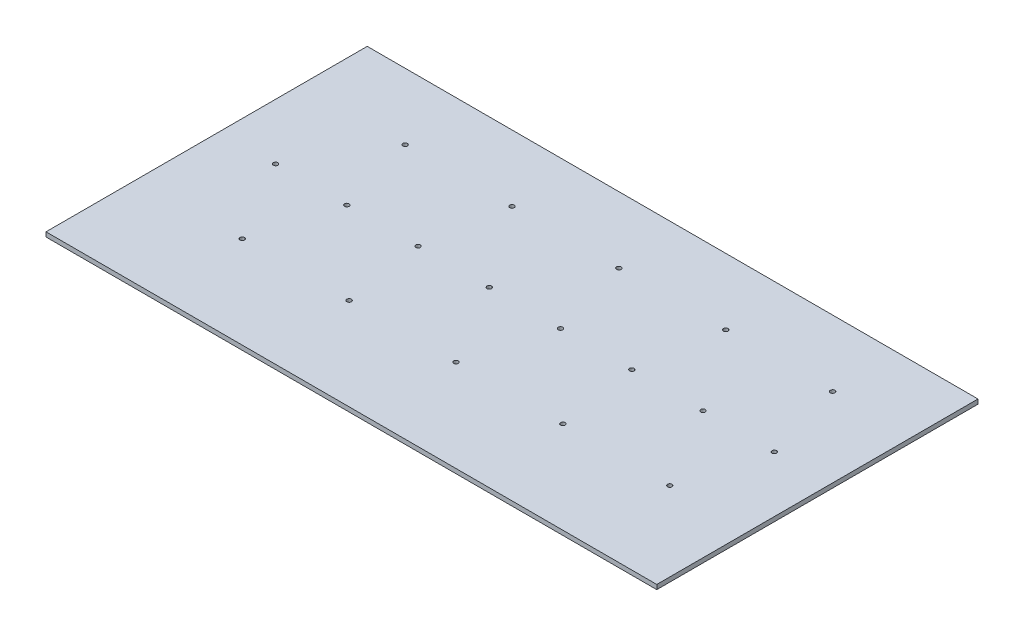
ISO-10303-21;
HEADER;
FILE_DESCRIPTION(('STEP AP214'),'2;1');
FILE_NAME('part.step','',(''),(''),'','','');
FILE_SCHEMA(('AUTOMOTIVE_DESIGN { 1 0 10303 214 1 1 1 1 }'));
ENDSEC;
DATA;
#1=APPLICATION_CONTEXT('core data for automotive mechanical design processes');
#2=APPLICATION_PROTOCOL_DEFINITION('international standard','automotive_design',2000,#1);
#3=PRODUCT_CONTEXT('',#1,'mechanical');
#4=PRODUCT('Part','Part','',(#3));
#5=PRODUCT_RELATED_PRODUCT_CATEGORY('part','',(#4));
#6=PRODUCT_DEFINITION_FORMATION('','',#4);
#7=PRODUCT_DEFINITION_CONTEXT('part definition',#1,'design');
#8=PRODUCT_DEFINITION('design','',#6,#7);
#9=PRODUCT_DEFINITION_SHAPE('','',#8);
#10=(LENGTH_UNIT() NAMED_UNIT(*) SI_UNIT(.MILLI.,.METRE.));
#11=(NAMED_UNIT(*) PLANE_ANGLE_UNIT() SI_UNIT($,.RADIAN.));
#12=(NAMED_UNIT(*) SI_UNIT($,.STERADIAN.) SOLID_ANGLE_UNIT());
#13=UNCERTAINTY_MEASURE_WITH_UNIT(LENGTH_MEASURE(1.E-05),#10,'distance_accuracy_value','');
#14=(GEOMETRIC_REPRESENTATION_CONTEXT(3) GLOBAL_UNCERTAINTY_ASSIGNED_CONTEXT((#13)) GLOBAL_UNIT_ASSIGNED_CONTEXT((#10,
#11,#12)) REPRESENTATION_CONTEXT('',''));
#15=CARTESIAN_POINT('',(0.,0.,0.));
#16=DIRECTION('',(0.,0.,1.));
#17=DIRECTION('',(1.,0.,0.));
#18=AXIS2_PLACEMENT_3D('',#15,#16,#17);
#19=CARTESIAN_POINT('',(0.,6.35,0.));
#20=DIRECTION('',(1.,0.,0.));
#21=DIRECTION('',(0.,0.,-1.));
#22=AXIS2_PLACEMENT_3D('',#19,#20,#21);
#23=PLANE('',#22);
#24=DIRECTION('',(0.,0.,1.));
#25=VECTOR('',#24,1.);
#26=CARTESIAN_POINT('',(0.,0.,0.));
#27=LINE('',#26,#25);
#28=CARTESIAN_POINT('',(0.,0.,-450.85));
#29=VERTEX_POINT('',#28);
#30=CARTESIAN_POINT('',(0.,0.,0.));
#31=VERTEX_POINT('',#30);
#32=EDGE_CURVE('E119',#29,#31,#27,.T.);
#33=ORIENTED_EDGE('',*,*,#32,.T.);
#34=DIRECTION('',(0.,-1.,0.));
#35=VECTOR('',#34,1.);
#36=CARTESIAN_POINT('',(0.,6.35,0.));
#37=LINE('',#36,#35);
#38=CARTESIAN_POINT('',(0.,6.35,0.));
#39=VERTEX_POINT('',#38);
#40=EDGE_CURVE('E11',#39,#31,#37,.T.);
#41=ORIENTED_EDGE('',*,*,#40,.F.);
#42=DIRECTION('',(0.,0.,1.));
#43=VECTOR('',#42,1.);
#44=CARTESIAN_POINT('',(0.,6.35,0.));
#45=LINE('',#44,#43);
#46=CARTESIAN_POINT('',(0.,6.35,-450.85));
#47=VERTEX_POINT('',#46);
#48=EDGE_CURVE('E103',#47,#39,#45,.T.);
#49=ORIENTED_EDGE('',*,*,#48,.F.);
#50=DIRECTION('',(0.,-1.,0.));
#51=VECTOR('',#50,1.);
#52=CARTESIAN_POINT('',(0.,6.35,-450.85));
#53=LINE('',#52,#51);
#54=EDGE_CURVE('E115',#47,#29,#53,.T.);
#55=ORIENTED_EDGE('',*,*,#54,.T.);
#56=EDGE_LOOP('',(#33,#41,#49,#55));
#57=FACE_BOUND('',#56,.T.);
#58=ADVANCED_FACE('F51',(#57),#23,.F.);
#59=CARTESIAN_POINT('',(0.,6.35,0.));
#60=DIRECTION('',(0.,0.,-1.));
#61=DIRECTION('',(-1.,0.,0.));
#62=AXIS2_PLACEMENT_3D('',#59,#60,#61);
#63=PLANE('',#62);
#64=DIRECTION('',(1.,0.,0.));
#65=VECTOR('',#64,1.);
#66=CARTESIAN_POINT('',(0.,0.,0.));
#67=LINE('',#66,#65);
#68=CARTESIAN_POINT('',(857.25,0.,0.));
#69=VERTEX_POINT('',#68);
#70=EDGE_CURVE('E108',#31,#69,#67,.T.);
#71=ORIENTED_EDGE('',*,*,#70,.T.);
#72=DIRECTION('',(0.,-1.,0.));
#73=VECTOR('',#72,1.);
#74=CARTESIAN_POINT('',(857.25,6.35,0.));
#75=LINE('',#74,#73);
#76=CARTESIAN_POINT('',(857.25,6.35,0.));
#77=VERTEX_POINT('',#76);
#78=EDGE_CURVE('E60',#77,#69,#75,.T.);
#79=ORIENTED_EDGE('',*,*,#78,.F.);
#80=DIRECTION('',(1.,0.,0.));
#81=VECTOR('',#80,1.);
#82=CARTESIAN_POINT('',(0.,6.35,0.));
#83=LINE('',#82,#81);
#84=EDGE_CURVE('E98',#39,#77,#83,.T.);
#85=ORIENTED_EDGE('',*,*,#84,.F.);
#86=ORIENTED_EDGE('',*,*,#40,.T.);
#87=EDGE_LOOP('',(#71,#79,#85,#86));
#88=FACE_BOUND('',#87,.T.);
#89=ADVANCED_FACE('F107',(#88),#63,.F.);
#90=CARTESIAN_POINT('',(857.25,6.35,0.));
#91=DIRECTION('',(-1.,0.,0.));
#92=DIRECTION('',(0.,0.,1.));
#93=AXIS2_PLACEMENT_3D('',#90,#91,#92);
#94=PLANE('',#93);
#95=DIRECTION('',(0.,0.,-1.));
#96=VECTOR('',#95,1.);
#97=CARTESIAN_POINT('',(857.25,0.,0.));
#98=LINE('',#97,#96);
#99=CARTESIAN_POINT('',(857.25,0.,-450.85));
#100=VERTEX_POINT('',#99);
#101=EDGE_CURVE('E85',#69,#100,#98,.T.);
#102=ORIENTED_EDGE('',*,*,#101,.T.);
#103=DIRECTION('',(0.,-1.,0.));
#104=VECTOR('',#103,1.);
#105=CARTESIAN_POINT('',(857.25,6.35,-450.85));
#106=LINE('',#105,#104);
#107=CARTESIAN_POINT('',(857.25,6.35,-450.85));
#108=VERTEX_POINT('',#107);
#109=EDGE_CURVE('E110',#108,#100,#106,.T.);
#110=ORIENTED_EDGE('',*,*,#109,.F.);
#111=DIRECTION('',(0.,0.,-1.));
#112=VECTOR('',#111,1.);
#113=CARTESIAN_POINT('',(857.25,6.35,0.));
#114=LINE('',#113,#112);
#115=EDGE_CURVE('E101',#77,#108,#114,.T.);
#116=ORIENTED_EDGE('',*,*,#115,.F.);
#117=ORIENTED_EDGE('',*,*,#78,.T.);
#118=EDGE_LOOP('',(#102,#110,#116,#117));
#119=FACE_BOUND('',#118,.T.);
#120=ADVANCED_FACE('F111',(#119),#94,.F.);
#121=CARTESIAN_POINT('',(0.,6.35,-450.85));
#122=DIRECTION('',(0.,0.,1.));
#123=DIRECTION('',(1.,0.,0.));
#124=AXIS2_PLACEMENT_3D('',#121,#122,#123);
#125=PLANE('',#124);
#126=DIRECTION('',(-1.,0.,0.));
#127=VECTOR('',#126,1.);
#128=CARTESIAN_POINT('',(0.,0.,-450.85));
#129=LINE('',#128,#127);
#130=EDGE_CURVE('E91',#100,#29,#129,.T.);
#131=ORIENTED_EDGE('',*,*,#130,.T.);
#132=ORIENTED_EDGE('',*,*,#54,.F.);
#133=DIRECTION('',(-1.,0.,0.));
#134=VECTOR('',#133,1.);
#135=CARTESIAN_POINT('',(0.,6.35,-450.85));
#136=LINE('',#135,#134);
#137=EDGE_CURVE('E68',#108,#47,#136,.T.);
#138=ORIENTED_EDGE('',*,*,#137,.F.);
#139=ORIENTED_EDGE('',*,*,#109,.T.);
#140=EDGE_LOOP('',(#131,#132,#138,#139));
#141=FACE_BOUND('',#140,.T.);
#142=ADVANCED_FACE('F133',(#141),#125,.F.);
#143=CARTESIAN_POINT('',(0.,6.35,0.));
#144=DIRECTION('',(0.,-1.,0.));
#145=DIRECTION('',(0.,0.,-1.));
#146=AXIS2_PLACEMENT_3D('',#143,#144,#145);
#147=PLANE('',#146);
#148=CARTESIAN_POINT('',(78.625,6.35,-243.567806769973));
#149=DIRECTION('',(0.,-1.,0.));
#150=DIRECTION('',(0.,0.,-1.));
#151=AXIS2_PLACEMENT_3D('',#148,#149,#150);
#152=CIRCLE('',#151,3.175);
#153=CARTESIAN_POINT('',(78.625,6.35,-246.742806769973));
#154=VERTEX_POINT('',#153);
#155=EDGE_CURVE('E123',#154,#154,#152,.T.);
#156=ORIENTED_EDGE('',*,*,#155,.T.);
#157=EDGE_LOOP('',(#156));
#158=FACE_BOUND('',#157,.T.);
#159=CARTESIAN_POINT('',(746.163,6.35,-129.267806769973));
#160=DIRECTION('',(0.,-1.,0.));
#161=DIRECTION('',(0.,0.,-1.));
#162=AXIS2_PLACEMENT_3D('',#159,#160,#161);
#163=CIRCLE('',#162,3.17500000000009);
#164=CARTESIAN_POINT('',(746.163,6.35,-132.442806769973));
#165=VERTEX_POINT('',#164);
#166=EDGE_CURVE('E143',#165,#165,#163,.T.);
#167=ORIENTED_EDGE('',*,*,#166,.T.);
#168=EDGE_LOOP('',(#167));
#169=FACE_BOUND('',#168,.T.);
#170=CARTESIAN_POINT('',(578.625,6.35,-243.567806769973));
#171=DIRECTION('',(0.,-1.,0.));
#172=DIRECTION('',(0.,0.,-1.));
#173=AXIS2_PLACEMENT_3D('',#170,#171,#172);
#174=CIRCLE('',#173,3.17499999999996);
#175=CARTESIAN_POINT('',(578.625,6.35,-246.742806769973));
#176=VERTEX_POINT('',#175);
#177=EDGE_CURVE('E147',#176,#176,#174,.T.);
#178=ORIENTED_EDGE('',*,*,#177,.T.);
#179=EDGE_LOOP('',(#178));
#180=FACE_BOUND('',#179,.T.);
#181=CARTESIAN_POINT('',(678.625,6.35,-243.567806769973));
#182=DIRECTION('',(0.,-1.,0.));
#183=DIRECTION('',(0.,0.,-1.));
#184=AXIS2_PLACEMENT_3D('',#181,#182,#183);
#185=CIRCLE('',#184,3.1750000000002);
#186=CARTESIAN_POINT('',(678.625,6.35,-246.742806769973));
#187=VERTEX_POINT('',#186);
#188=EDGE_CURVE('E151',#187,#187,#185,.T.);
#189=ORIENTED_EDGE('',*,*,#188,.T.);
#190=EDGE_LOOP('',(#189));
#191=FACE_BOUND('',#190,.T.);
#192=CARTESIAN_POINT('',(146.163,6.35,-357.867806769972));
#193=DIRECTION('',(0.,-1.,0.));
#194=DIRECTION('',(0.,0.,-1.));
#195=AXIS2_PLACEMENT_3D('',#192,#193,#194);
#196=CIRCLE('',#195,3.175);
#197=CARTESIAN_POINT('',(146.163,6.35,-361.042806769972));
#198=VERTEX_POINT('',#197);
#199=EDGE_CURVE('E155',#198,#198,#196,.T.);
#200=ORIENTED_EDGE('',*,*,#199,.T.);
#201=EDGE_LOOP('',(#200));
#202=FACE_BOUND('',#201,.T.);
#203=CARTESIAN_POINT('',(778.625,6.35,-243.567806769973));
#204=DIRECTION('',(0.,-1.,0.));
#205=DIRECTION('',(0.,0.,-1.));
#206=AXIS2_PLACEMENT_3D('',#203,#204,#205);
#207=CIRCLE('',#206,3.17500000000009);
#208=CARTESIAN_POINT('',(778.625,6.35,-246.742806769973));
#209=VERTEX_POINT('',#208);
#210=EDGE_CURVE('E159',#209,#209,#207,.T.);
#211=ORIENTED_EDGE('',*,*,#210,.T.);
#212=EDGE_LOOP('',(#211));
#213=FACE_BOUND('',#212,.T.);
#214=CARTESIAN_POINT('',(278.625,6.35,-243.567806769973));
#215=DIRECTION('',(0.,-1.,0.));
#216=DIRECTION('',(0.,0.,-1.));
#217=AXIS2_PLACEMENT_3D('',#214,#215,#216);
#218=CIRCLE('',#217,3.17499999999997);
#219=CARTESIAN_POINT('',(278.625,6.35,-246.742806769973));
#220=VERTEX_POINT('',#219);
#221=EDGE_CURVE('E163',#220,#220,#218,.T.);
#222=ORIENTED_EDGE('',*,*,#221,.T.);
#223=EDGE_LOOP('',(#222));
#224=FACE_BOUND('',#223,.T.);
#225=CARTESIAN_POINT('',(378.625,6.35,-243.567806769973));
#226=DIRECTION('',(0.,-1.,0.));
#227=DIRECTION('',(0.,0.,-1.));
#228=AXIS2_PLACEMENT_3D('',#225,#226,#227);
#229=CIRCLE('',#228,3.17499999999997);
#230=CARTESIAN_POINT('',(378.625,6.35,-246.742806769973));
#231=VERTEX_POINT('',#230);
#232=EDGE_CURVE('E167',#231,#231,#229,.T.);
#233=ORIENTED_EDGE('',*,*,#232,.T.);
#234=EDGE_LOOP('',(#233));
#235=FACE_BOUND('',#234,.T.);
#236=CARTESIAN_POINT('',(178.625,6.35,-243.567806769973));
#237=DIRECTION('',(0.,-1.,0.));
#238=DIRECTION('',(0.,0.,-1.));
#239=AXIS2_PLACEMENT_3D('',#236,#237,#238);
#240=CIRCLE('',#239,3.17499999999997);
#241=CARTESIAN_POINT('',(178.625,6.35,-246.742806769973));
#242=VERTEX_POINT('',#241);
#243=EDGE_CURVE('E171',#242,#242,#240,.T.);
#244=ORIENTED_EDGE('',*,*,#243,.T.);
#245=EDGE_LOOP('',(#244));
#246=FACE_BOUND('',#245,.T.);
#247=CARTESIAN_POINT('',(478.625,6.35,-243.567806769973));
#248=DIRECTION('',(0.,-1.,0.));
#249=DIRECTION('',(0.,0.,-1.));
#250=AXIS2_PLACEMENT_3D('',#247,#248,#249);
#251=CIRCLE('',#250,3.17500000000009);
#252=CARTESIAN_POINT('',(478.625,6.35,-246.742806769973));
#253=VERTEX_POINT('',#252);
#254=EDGE_CURVE('E175',#253,#253,#251,.T.);
#255=ORIENTED_EDGE('',*,*,#254,.T.);
#256=EDGE_LOOP('',(#255));
#257=FACE_BOUND('',#256,.T.);
#258=CARTESIAN_POINT('',(296.163,6.35,-357.867806769972));
#259=DIRECTION('',(0.,-1.,0.));
#260=DIRECTION('',(0.,0.,-1.));
#261=AXIS2_PLACEMENT_3D('',#258,#259,#260);
#262=CIRCLE('',#261,3.17499999999997);
#263=CARTESIAN_POINT('',(296.163,6.35,-361.042806769972));
#264=VERTEX_POINT('',#263);
#265=EDGE_CURVE('E179',#264,#264,#262,.T.);
#266=ORIENTED_EDGE('',*,*,#265,.T.);
#267=EDGE_LOOP('',(#266));
#268=FACE_BOUND('',#267,.T.);
#269=CARTESIAN_POINT('',(446.163,6.35,-357.867806769972));
#270=DIRECTION('',(0.,-1.,0.));
#271=DIRECTION('',(0.,0.,-1.));
#272=AXIS2_PLACEMENT_3D('',#269,#270,#271);
#273=CIRCLE('',#272,3.17499999999997);
#274=CARTESIAN_POINT('',(446.163,6.35,-361.042806769972));
#275=VERTEX_POINT('',#274);
#276=EDGE_CURVE('E183',#275,#275,#273,.T.);
#277=ORIENTED_EDGE('',*,*,#276,.T.);
#278=EDGE_LOOP('',(#277));
#279=FACE_BOUND('',#278,.T.);
#280=CARTESIAN_POINT('',(596.163,6.35,-357.867806769972));
#281=DIRECTION('',(0.,-1.,0.));
#282=DIRECTION('',(0.,0.,-1.));
#283=AXIS2_PLACEMENT_3D('',#280,#281,#282);
#284=CIRCLE('',#283,3.17499999999997);
#285=CARTESIAN_POINT('',(596.163,6.35,-361.042806769972));
#286=VERTEX_POINT('',#285);
#287=EDGE_CURVE('E187',#286,#286,#284,.T.);
#288=ORIENTED_EDGE('',*,*,#287,.T.);
#289=EDGE_LOOP('',(#288));
#290=FACE_BOUND('',#289,.T.);
#291=CARTESIAN_POINT('',(746.163,6.35,-357.867806769973));
#292=DIRECTION('',(0.,-1.,0.));
#293=DIRECTION('',(0.,0.,-1.));
#294=AXIS2_PLACEMENT_3D('',#291,#292,#293);
#295=CIRCLE('',#294,3.17500000000008);
#296=CARTESIAN_POINT('',(746.163,6.35,-361.042806769973));
#297=VERTEX_POINT('',#296);
#298=EDGE_CURVE('E191',#297,#297,#295,.T.);
#299=ORIENTED_EDGE('',*,*,#298,.T.);
#300=EDGE_LOOP('',(#299));
#301=FACE_BOUND('',#300,.T.);
#302=CARTESIAN_POINT('',(146.163,6.35,-129.267806769973));
#303=DIRECTION('',(0.,-1.,0.));
#304=DIRECTION('',(0.,0.,-1.));
#305=AXIS2_PLACEMENT_3D('',#302,#303,#304);
#306=CIRCLE('',#305,3.175);
#307=CARTESIAN_POINT('',(146.163,6.35,-132.442806769973));
#308=VERTEX_POINT('',#307);
#309=EDGE_CURVE('E195',#308,#308,#306,.T.);
#310=ORIENTED_EDGE('',*,*,#309,.T.);
#311=EDGE_LOOP('',(#310));
#312=FACE_BOUND('',#311,.T.);
#313=CARTESIAN_POINT('',(296.163,6.35,-129.267806769973));
#314=DIRECTION('',(0.,-1.,0.));
#315=DIRECTION('',(0.,0.,-1.));
#316=AXIS2_PLACEMENT_3D('',#313,#314,#315);
#317=CIRCLE('',#316,3.17499999999997);
#318=CARTESIAN_POINT('',(296.163,6.35,-132.442806769973));
#319=VERTEX_POINT('',#318);
#320=EDGE_CURVE('E199',#319,#319,#317,.T.);
#321=ORIENTED_EDGE('',*,*,#320,.T.);
#322=EDGE_LOOP('',(#321));
#323=FACE_BOUND('',#322,.T.);
#324=CARTESIAN_POINT('',(446.163,6.35,-129.267806769973));
#325=DIRECTION('',(0.,-1.,0.));
#326=DIRECTION('',(0.,0.,-1.));
#327=AXIS2_PLACEMENT_3D('',#324,#325,#326);
#328=CIRCLE('',#327,3.17499999999997);
#329=CARTESIAN_POINT('',(446.163,6.35,-132.442806769973));
#330=VERTEX_POINT('',#329);
#331=EDGE_CURVE('E203',#330,#330,#328,.T.);
#332=ORIENTED_EDGE('',*,*,#331,.T.);
#333=EDGE_LOOP('',(#332));
#334=FACE_BOUND('',#333,.T.);
#335=CARTESIAN_POINT('',(596.163,6.35,-129.267806769973));
#336=DIRECTION('',(0.,-1.,0.));
#337=DIRECTION('',(0.,0.,-1.));
#338=AXIS2_PLACEMENT_3D('',#335,#336,#337);
#339=CIRCLE('',#338,3.17500000000009);
#340=CARTESIAN_POINT('',(596.163,6.35,-132.442806769973));
#341=VERTEX_POINT('',#340);
#342=EDGE_CURVE('E207',#341,#341,#339,.T.);
#343=ORIENTED_EDGE('',*,*,#342,.T.);
#344=EDGE_LOOP('',(#343));
#345=FACE_BOUND('',#344,.T.);
#346=ORIENTED_EDGE('',*,*,#48,.T.);
#347=ORIENTED_EDGE('',*,*,#84,.T.);
#348=ORIENTED_EDGE('',*,*,#115,.T.);
#349=ORIENTED_EDGE('',*,*,#137,.T.);
#350=EDGE_LOOP('',(#346,#347,#348,#349));
#351=FACE_BOUND('',#350,.T.);
#352=ADVANCED_FACE('F99',(#158,#169,#180,#191,#202,#213,#224,#235,#246,#257,#268,#279,#290,#301,
#312,#323,#334,#345,#351),#147,.F.);
#353=CARTESIAN_POINT('',(0.,0.,0.));
#354=DIRECTION('',(0.,-1.,0.));
#355=DIRECTION('',(0.,0.,-1.));
#356=AXIS2_PLACEMENT_3D('',#353,#354,#355);
#357=PLANE('',#356);
#358=CARTESIAN_POINT('',(78.625,0.,-243.567806769973));
#359=DIRECTION('',(0.,1.,0.));
#360=DIRECTION('',(0.,0.,1.));
#361=AXIS2_PLACEMENT_3D('',#358,#359,#360);
#362=CIRCLE('',#361,3.175);
#363=CARTESIAN_POINT('',(78.625,0.,-240.392806769973));
#364=VERTEX_POINT('',#363);
#365=EDGE_CURVE('E211',#364,#364,#362,.T.);
#366=ORIENTED_EDGE('',*,*,#365,.T.);
#367=EDGE_LOOP('',(#366));
#368=FACE_BOUND('',#367,.T.);
#369=CARTESIAN_POINT('',(746.163,0.,-129.267806769973));
#370=DIRECTION('',(0.,1.,0.));
#371=DIRECTION('',(0.,0.,1.));
#372=AXIS2_PLACEMENT_3D('',#369,#370,#371);
#373=CIRCLE('',#372,3.17500000000009);
#374=CARTESIAN_POINT('',(746.163,0.,-126.092806769973));
#375=VERTEX_POINT('',#374);
#376=EDGE_CURVE('E250',#375,#375,#373,.T.);
#377=ORIENTED_EDGE('',*,*,#376,.T.);
#378=EDGE_LOOP('',(#377));
#379=FACE_BOUND('',#378,.T.);
#380=CARTESIAN_POINT('',(578.625,0.,-243.567806769973));
#381=DIRECTION('',(0.,1.,0.));
#382=DIRECTION('',(0.,0.,1.));
#383=AXIS2_PLACEMENT_3D('',#380,#381,#382);
#384=CIRCLE('',#383,3.17499999999996);
#385=CARTESIAN_POINT('',(578.625,0.,-240.392806769973));
#386=VERTEX_POINT('',#385);
#387=EDGE_CURVE('E225',#386,#386,#384,.T.);
#388=ORIENTED_EDGE('',*,*,#387,.T.);
#389=EDGE_LOOP('',(#388));
#390=FACE_BOUND('',#389,.T.);
#391=CARTESIAN_POINT('',(678.625,0.,-243.567806769973));
#392=DIRECTION('',(0.,1.,0.));
#393=DIRECTION('',(0.,0.,1.));
#394=AXIS2_PLACEMENT_3D('',#391,#392,#393);
#395=CIRCLE('',#394,3.1750000000002);
#396=CARTESIAN_POINT('',(678.625,0.,-240.392806769972));
#397=VERTEX_POINT('',#396);
#398=EDGE_CURVE('E229',#397,#397,#395,.T.);
#399=ORIENTED_EDGE('',*,*,#398,.T.);
#400=EDGE_LOOP('',(#399));
#401=FACE_BOUND('',#400,.T.);
#402=CARTESIAN_POINT('',(146.163,0.,-357.867806769972));
#403=DIRECTION('',(0.,1.,0.));
#404=DIRECTION('',(0.,0.,1.));
#405=AXIS2_PLACEMENT_3D('',#402,#403,#404);
#406=CIRCLE('',#405,3.175);
#407=CARTESIAN_POINT('',(146.163,0.,-354.692806769972));
#408=VERTEX_POINT('',#407);
#409=EDGE_CURVE('E233',#408,#408,#406,.T.);
#410=ORIENTED_EDGE('',*,*,#409,.T.);
#411=EDGE_LOOP('',(#410));
#412=FACE_BOUND('',#411,.T.);
#413=CARTESIAN_POINT('',(778.625,0.,-243.567806769973));
#414=DIRECTION('',(0.,1.,0.));
#415=DIRECTION('',(0.,0.,1.));
#416=AXIS2_PLACEMENT_3D('',#413,#414,#415);
#417=CIRCLE('',#416,3.17500000000009);
#418=CARTESIAN_POINT('',(778.625,0.,-240.392806769973));
#419=VERTEX_POINT('',#418);
#420=EDGE_CURVE('E237',#419,#419,#417,.T.);
#421=ORIENTED_EDGE('',*,*,#420,.T.);
#422=EDGE_LOOP('',(#421));
#423=FACE_BOUND('',#422,.T.);
#424=CARTESIAN_POINT('',(278.625,0.,-243.567806769973));
#425=DIRECTION('',(0.,1.,0.));
#426=DIRECTION('',(0.,0.,1.));
#427=AXIS2_PLACEMENT_3D('',#424,#425,#426);
#428=CIRCLE('',#427,3.17499999999997);
#429=CARTESIAN_POINT('',(278.625,0.,-240.392806769973));
#430=VERTEX_POINT('',#429);
#431=EDGE_CURVE('E216',#430,#430,#428,.T.);
#432=ORIENTED_EDGE('',*,*,#431,.T.);
#433=EDGE_LOOP('',(#432));
#434=FACE_BOUND('',#433,.T.);
#435=CARTESIAN_POINT('',(378.625,0.,-243.567806769973));
#436=DIRECTION('',(0.,1.,0.));
#437=DIRECTION('',(0.,0.,1.));
#438=AXIS2_PLACEMENT_3D('',#435,#436,#437);
#439=CIRCLE('',#438,3.17499999999997);
#440=CARTESIAN_POINT('',(378.625,0.,-240.392806769973));
#441=VERTEX_POINT('',#440);
#442=EDGE_CURVE('E212',#441,#441,#439,.T.);
#443=ORIENTED_EDGE('',*,*,#442,.T.);
#444=EDGE_LOOP('',(#443));
#445=FACE_BOUND('',#444,.T.);
#446=CARTESIAN_POINT('',(178.625,0.,-243.567806769973));
#447=DIRECTION('',(0.,1.,0.));
#448=DIRECTION('',(0.,0.,1.));
#449=AXIS2_PLACEMENT_3D('',#446,#447,#448);
#450=CIRCLE('',#449,3.17499999999997);
#451=CARTESIAN_POINT('',(178.625,0.,-240.392806769973));
#452=VERTEX_POINT('',#451);
#453=EDGE_CURVE('E217',#452,#452,#450,.T.);
#454=ORIENTED_EDGE('',*,*,#453,.T.);
#455=EDGE_LOOP('',(#454));
#456=FACE_BOUND('',#455,.T.);
#457=CARTESIAN_POINT('',(478.625,0.,-243.567806769973));
#458=DIRECTION('',(0.,1.,0.));
#459=DIRECTION('',(0.,0.,1.));
#460=AXIS2_PLACEMENT_3D('',#457,#458,#459);
#461=CIRCLE('',#460,3.17500000000009);
#462=CARTESIAN_POINT('',(478.625,0.,-240.392806769973));
#463=VERTEX_POINT('',#462);
#464=EDGE_CURVE('E221',#463,#463,#461,.T.);
#465=ORIENTED_EDGE('',*,*,#464,.T.);
#466=EDGE_LOOP('',(#465));
#467=FACE_BOUND('',#466,.T.);
#468=CARTESIAN_POINT('',(296.163,0.,-357.867806769972));
#469=DIRECTION('',(0.,1.,0.));
#470=DIRECTION('',(0.,0.,1.));
#471=AXIS2_PLACEMENT_3D('',#468,#469,#470);
#472=CIRCLE('',#471,3.17499999999997);
#473=CARTESIAN_POINT('',(296.163,0.,-354.692806769972));
#474=VERTEX_POINT('',#473);
#475=EDGE_CURVE('E241',#474,#474,#472,.T.);
#476=ORIENTED_EDGE('',*,*,#475,.T.);
#477=EDGE_LOOP('',(#476));
#478=FACE_BOUND('',#477,.T.);
#479=CARTESIAN_POINT('',(446.163,0.,-357.867806769972));
#480=DIRECTION('',(0.,1.,0.));
#481=DIRECTION('',(0.,0.,1.));
#482=AXIS2_PLACEMENT_3D('',#479,#480,#481);
#483=CIRCLE('',#482,3.17499999999997);
#484=CARTESIAN_POINT('',(446.163,0.,-354.692806769972));
#485=VERTEX_POINT('',#484);
#486=EDGE_CURVE('E270',#485,#485,#483,.T.);
#487=ORIENTED_EDGE('',*,*,#486,.T.);
#488=EDGE_LOOP('',(#487));
#489=FACE_BOUND('',#488,.T.);
#490=CARTESIAN_POINT('',(596.163,0.,-357.867806769972));
#491=DIRECTION('',(0.,1.,0.));
#492=DIRECTION('',(0.,0.,1.));
#493=AXIS2_PLACEMENT_3D('',#490,#491,#492);
#494=CIRCLE('',#493,3.17499999999997);
#495=CARTESIAN_POINT('',(596.163,0.,-354.692806769972));
#496=VERTEX_POINT('',#495);
#497=EDGE_CURVE('E266',#496,#496,#494,.T.);
#498=ORIENTED_EDGE('',*,*,#497,.T.);
#499=EDGE_LOOP('',(#498));
#500=FACE_BOUND('',#499,.T.);
#501=CARTESIAN_POINT('',(746.163,0.,-357.867806769973));
#502=DIRECTION('',(0.,1.,0.));
#503=DIRECTION('',(0.,0.,1.));
#504=AXIS2_PLACEMENT_3D('',#501,#502,#503);
#505=CIRCLE('',#504,3.17500000000008);
#506=CARTESIAN_POINT('',(746.163,0.,-354.692806769972));
#507=VERTEX_POINT('',#506);
#508=EDGE_CURVE('E262',#507,#507,#505,.T.);
#509=ORIENTED_EDGE('',*,*,#508,.T.);
#510=EDGE_LOOP('',(#509));
#511=FACE_BOUND('',#510,.T.);
#512=CARTESIAN_POINT('',(146.163,0.,-129.267806769973));
#513=DIRECTION('',(0.,1.,0.));
#514=DIRECTION('',(0.,0.,1.));
#515=AXIS2_PLACEMENT_3D('',#512,#513,#514);
#516=CIRCLE('',#515,3.175);
#517=CARTESIAN_POINT('',(146.163,0.,-126.092806769973));
#518=VERTEX_POINT('',#517);
#519=EDGE_CURVE('E258',#518,#518,#516,.T.);
#520=ORIENTED_EDGE('',*,*,#519,.T.);
#521=EDGE_LOOP('',(#520));
#522=FACE_BOUND('',#521,.T.);
#523=CARTESIAN_POINT('',(296.163,0.,-129.267806769973));
#524=DIRECTION('',(0.,1.,0.));
#525=DIRECTION('',(0.,0.,1.));
#526=AXIS2_PLACEMENT_3D('',#523,#524,#525);
#527=CIRCLE('',#526,3.17499999999997);
#528=CARTESIAN_POINT('',(296.163,0.,-126.092806769973));
#529=VERTEX_POINT('',#528);
#530=EDGE_CURVE('E254',#529,#529,#527,.T.);
#531=ORIENTED_EDGE('',*,*,#530,.T.);
#532=EDGE_LOOP('',(#531));
#533=FACE_BOUND('',#532,.T.);
#534=CARTESIAN_POINT('',(446.163,0.,-129.267806769973));
#535=DIRECTION('',(0.,1.,0.));
#536=DIRECTION('',(0.,0.,1.));
#537=AXIS2_PLACEMENT_3D('',#534,#535,#536);
#538=CIRCLE('',#537,3.17499999999997);
#539=CARTESIAN_POINT('',(446.163,0.,-126.092806769973));
#540=VERTEX_POINT('',#539);
#541=EDGE_CURVE('E249',#540,#540,#538,.T.);
#542=ORIENTED_EDGE('',*,*,#541,.T.);
#543=EDGE_LOOP('',(#542));
#544=FACE_BOUND('',#543,.T.);
#545=CARTESIAN_POINT('',(596.163,0.,-129.267806769973));
#546=DIRECTION('',(0.,1.,0.));
#547=DIRECTION('',(0.,0.,1.));
#548=AXIS2_PLACEMENT_3D('',#545,#546,#547);
#549=CIRCLE('',#548,3.17500000000009);
#550=CARTESIAN_POINT('',(596.163,0.,-126.092806769973));
#551=VERTEX_POINT('',#550);
#552=EDGE_CURVE('E245',#551,#551,#549,.T.);
#553=ORIENTED_EDGE('',*,*,#552,.T.);
#554=EDGE_LOOP('',(#553));
#555=FACE_BOUND('',#554,.T.);
#556=ORIENTED_EDGE('',*,*,#32,.F.);
#557=ORIENTED_EDGE('',*,*,#130,.F.);
#558=ORIENTED_EDGE('',*,*,#101,.F.);
#559=ORIENTED_EDGE('',*,*,#70,.F.);
#560=EDGE_LOOP('',(#556,#557,#558,#559));
#561=FACE_BOUND('',#560,.T.);
#562=ADVANCED_FACE('F136',(#368,#379,#390,#401,#412,#423,#434,#445,#456,#467,#478,#489,#500,
#511,#522,#533,#544,#555,#561),#357,.T.);
#563=CARTESIAN_POINT('',(596.163,0.,-129.267806769973));
#564=DIRECTION('',(0.,1.,0.));
#565=DIRECTION('',(0.,0.,1.));
#566=AXIS2_PLACEMENT_3D('',#563,#564,#565);
#567=CYLINDRICAL_SURFACE('',#566,3.17500000000009);
#568=ORIENTED_EDGE('',*,*,#552,.F.);
#569=EDGE_LOOP('',(#568));
#570=FACE_BOUND('',#569,.T.);
#571=ORIENTED_EDGE('',*,*,#342,.F.);
#572=EDGE_LOOP('',(#571));
#573=FACE_BOUND('',#572,.T.);
#574=ADVANCED_FACE('F330',(#570,#573),#567,.F.);
#575=CARTESIAN_POINT('',(446.163,0.,-129.267806769973));
#576=DIRECTION('',(0.,1.,0.));
#577=DIRECTION('',(0.,0.,1.));
#578=AXIS2_PLACEMENT_3D('',#575,#576,#577);
#579=CYLINDRICAL_SURFACE('',#578,3.17499999999997);
#580=ORIENTED_EDGE('',*,*,#541,.F.);
#581=EDGE_LOOP('',(#580));
#582=FACE_BOUND('',#581,.T.);
#583=ORIENTED_EDGE('',*,*,#331,.F.);
#584=EDGE_LOOP('',(#583));
#585=FACE_BOUND('',#584,.T.);
#586=ADVANCED_FACE('F332',(#582,#585),#579,.F.);
#587=CARTESIAN_POINT('',(296.163,0.,-129.267806769973));
#588=DIRECTION('',(0.,1.,0.));
#589=DIRECTION('',(0.,0.,1.));
#590=AXIS2_PLACEMENT_3D('',#587,#588,#589);
#591=CYLINDRICAL_SURFACE('',#590,3.17499999999997);
#592=ORIENTED_EDGE('',*,*,#530,.F.);
#593=EDGE_LOOP('',(#592));
#594=FACE_BOUND('',#593,.T.);
#595=ORIENTED_EDGE('',*,*,#320,.F.);
#596=EDGE_LOOP('',(#595));
#597=FACE_BOUND('',#596,.T.);
#598=ADVANCED_FACE('F339',(#594,#597),#591,.F.);
#599=CARTESIAN_POINT('',(146.163,0.,-129.267806769973));
#600=DIRECTION('',(0.,1.,0.));
#601=DIRECTION('',(0.,0.,1.));
#602=AXIS2_PLACEMENT_3D('',#599,#600,#601);
#603=CYLINDRICAL_SURFACE('',#602,3.175);
#604=ORIENTED_EDGE('',*,*,#519,.F.);
#605=EDGE_LOOP('',(#604));
#606=FACE_BOUND('',#605,.T.);
#607=ORIENTED_EDGE('',*,*,#309,.F.);
#608=EDGE_LOOP('',(#607));
#609=FACE_BOUND('',#608,.T.);
#610=ADVANCED_FACE('F421',(#606,#609),#603,.F.);
#611=CARTESIAN_POINT('',(746.163,0.,-357.867806769973));
#612=DIRECTION('',(0.,1.,0.));
#613=DIRECTION('',(0.,0.,1.));
#614=AXIS2_PLACEMENT_3D('',#611,#612,#613);
#615=CYLINDRICAL_SURFACE('',#614,3.17500000000008);
#616=ORIENTED_EDGE('',*,*,#508,.F.);
#617=EDGE_LOOP('',(#616));
#618=FACE_BOUND('',#617,.T.);
#619=ORIENTED_EDGE('',*,*,#298,.F.);
#620=EDGE_LOOP('',(#619));
#621=FACE_BOUND('',#620,.T.);
#622=ADVANCED_FACE('F426',(#618,#621),#615,.F.);
#623=CARTESIAN_POINT('',(596.163,0.,-357.867806769972));
#624=DIRECTION('',(0.,1.,0.));
#625=DIRECTION('',(0.,0.,1.));
#626=AXIS2_PLACEMENT_3D('',#623,#624,#625);
#627=CYLINDRICAL_SURFACE('',#626,3.17499999999997);
#628=ORIENTED_EDGE('',*,*,#497,.F.);
#629=EDGE_LOOP('',(#628));
#630=FACE_BOUND('',#629,.T.);
#631=ORIENTED_EDGE('',*,*,#287,.F.);
#632=EDGE_LOOP('',(#631));
#633=FACE_BOUND('',#632,.T.);
#634=ADVANCED_FACE('F432',(#630,#633),#627,.F.);
#635=CARTESIAN_POINT('',(446.163,0.,-357.867806769972));
#636=DIRECTION('',(0.,1.,0.));
#637=DIRECTION('',(0.,0.,1.));
#638=AXIS2_PLACEMENT_3D('',#635,#636,#637);
#639=CYLINDRICAL_SURFACE('',#638,3.17499999999997);
#640=ORIENTED_EDGE('',*,*,#486,.F.);
#641=EDGE_LOOP('',(#640));
#642=FACE_BOUND('',#641,.T.);
#643=ORIENTED_EDGE('',*,*,#276,.F.);
#644=EDGE_LOOP('',(#643));
#645=FACE_BOUND('',#644,.T.);
#646=ADVANCED_FACE('F436',(#642,#645),#639,.F.);
#647=CARTESIAN_POINT('',(296.163,0.,-357.867806769972));
#648=DIRECTION('',(0.,1.,0.));
#649=DIRECTION('',(0.,0.,1.));
#650=AXIS2_PLACEMENT_3D('',#647,#648,#649);
#651=CYLINDRICAL_SURFACE('',#650,3.17499999999997);
#652=ORIENTED_EDGE('',*,*,#475,.F.);
#653=EDGE_LOOP('',(#652));
#654=FACE_BOUND('',#653,.T.);
#655=ORIENTED_EDGE('',*,*,#265,.F.);
#656=EDGE_LOOP('',(#655));
#657=FACE_BOUND('',#656,.T.);
#658=ADVANCED_FACE('F369',(#654,#657),#651,.F.);
#659=CARTESIAN_POINT('',(478.625,0.,-243.567806769973));
#660=DIRECTION('',(0.,1.,0.));
#661=DIRECTION('',(0.,0.,1.));
#662=AXIS2_PLACEMENT_3D('',#659,#660,#661);
#663=CYLINDRICAL_SURFACE('',#662,3.17500000000009);
#664=ORIENTED_EDGE('',*,*,#464,.F.);
#665=EDGE_LOOP('',(#664));
#666=FACE_BOUND('',#665,.T.);
#667=ORIENTED_EDGE('',*,*,#254,.F.);
#668=EDGE_LOOP('',(#667));
#669=FACE_BOUND('',#668,.T.);
#670=ADVANCED_FACE('F366',(#666,#669),#663,.F.);
#671=CARTESIAN_POINT('',(178.625,0.,-243.567806769973));
#672=DIRECTION('',(0.,1.,0.));
#673=DIRECTION('',(0.,0.,1.));
#674=AXIS2_PLACEMENT_3D('',#671,#672,#673);
#675=CYLINDRICAL_SURFACE('',#674,3.17499999999997);
#676=ORIENTED_EDGE('',*,*,#453,.F.);
#677=EDGE_LOOP('',(#676));
#678=FACE_BOUND('',#677,.T.);
#679=ORIENTED_EDGE('',*,*,#243,.F.);
#680=EDGE_LOOP('',(#679));
#681=FACE_BOUND('',#680,.T.);
#682=ADVANCED_FACE('F360',(#678,#681),#675,.F.);
#683=CARTESIAN_POINT('',(378.625,0.,-243.567806769973));
#684=DIRECTION('',(0.,1.,0.));
#685=DIRECTION('',(0.,0.,1.));
#686=AXIS2_PLACEMENT_3D('',#683,#684,#685);
#687=CYLINDRICAL_SURFACE('',#686,3.17499999999997);
#688=ORIENTED_EDGE('',*,*,#442,.F.);
#689=EDGE_LOOP('',(#688));
#690=FACE_BOUND('',#689,.T.);
#691=ORIENTED_EDGE('',*,*,#232,.F.);
#692=EDGE_LOOP('',(#691));
#693=FACE_BOUND('',#692,.T.);
#694=ADVANCED_FACE('F356',(#690,#693),#687,.F.);
#695=CARTESIAN_POINT('',(278.625,0.,-243.567806769973));
#696=DIRECTION('',(0.,1.,0.));
#697=DIRECTION('',(0.,0.,1.));
#698=AXIS2_PLACEMENT_3D('',#695,#696,#697);
#699=CYLINDRICAL_SURFACE('',#698,3.17499999999997);
#700=ORIENTED_EDGE('',*,*,#431,.F.);
#701=EDGE_LOOP('',(#700));
#702=FACE_BOUND('',#701,.T.);
#703=ORIENTED_EDGE('',*,*,#221,.F.);
#704=EDGE_LOOP('',(#703));
#705=FACE_BOUND('',#704,.T.);
#706=ADVANCED_FACE('F359',(#702,#705),#699,.F.);
#707=CARTESIAN_POINT('',(778.625,0.,-243.567806769973));
#708=DIRECTION('',(0.,1.,0.));
#709=DIRECTION('',(0.,0.,1.));
#710=AXIS2_PLACEMENT_3D('',#707,#708,#709);
#711=CYLINDRICAL_SURFACE('',#710,3.17500000000009);
#712=ORIENTED_EDGE('',*,*,#420,.F.);
#713=EDGE_LOOP('',(#712));
#714=FACE_BOUND('',#713,.T.);
#715=ORIENTED_EDGE('',*,*,#210,.F.);
#716=EDGE_LOOP('',(#715));
#717=FACE_BOUND('',#716,.T.);
#718=ADVANCED_FACE('F364',(#714,#717),#711,.F.);
#719=CARTESIAN_POINT('',(146.163,0.,-357.867806769972));
#720=DIRECTION('',(0.,1.,0.));
#721=DIRECTION('',(0.,0.,1.));
#722=AXIS2_PLACEMENT_3D('',#719,#720,#721);
#723=CYLINDRICAL_SURFACE('',#722,3.175);
#724=ORIENTED_EDGE('',*,*,#409,.F.);
#725=EDGE_LOOP('',(#724));
#726=FACE_BOUND('',#725,.T.);
#727=ORIENTED_EDGE('',*,*,#199,.F.);
#728=EDGE_LOOP('',(#727));
#729=FACE_BOUND('',#728,.T.);
#730=ADVANCED_FACE('F378',(#726,#729),#723,.F.);
#731=CARTESIAN_POINT('',(678.625,0.,-243.567806769973));
#732=DIRECTION('',(0.,1.,0.));
#733=DIRECTION('',(0.,0.,1.));
#734=AXIS2_PLACEMENT_3D('',#731,#732,#733);
#735=CYLINDRICAL_SURFACE('',#734,3.1750000000002);
#736=ORIENTED_EDGE('',*,*,#398,.F.);
#737=EDGE_LOOP('',(#736));
#738=FACE_BOUND('',#737,.T.);
#739=ORIENTED_EDGE('',*,*,#188,.F.);
#740=EDGE_LOOP('',(#739));
#741=FACE_BOUND('',#740,.T.);
#742=ADVANCED_FACE('F374',(#738,#741),#735,.F.);
#743=CARTESIAN_POINT('',(578.625,0.,-243.567806769973));
#744=DIRECTION('',(0.,1.,0.));
#745=DIRECTION('',(0.,0.,1.));
#746=AXIS2_PLACEMENT_3D('',#743,#744,#745);
#747=CYLINDRICAL_SURFACE('',#746,3.17499999999996);
#748=ORIENTED_EDGE('',*,*,#387,.F.);
#749=EDGE_LOOP('',(#748));
#750=FACE_BOUND('',#749,.T.);
#751=ORIENTED_EDGE('',*,*,#177,.F.);
#752=EDGE_LOOP('',(#751));
#753=FACE_BOUND('',#752,.T.);
#754=ADVANCED_FACE('F377',(#750,#753),#747,.F.);
#755=CARTESIAN_POINT('',(746.163,0.,-129.267806769973));
#756=DIRECTION('',(0.,1.,0.));
#757=DIRECTION('',(0.,0.,1.));
#758=AXIS2_PLACEMENT_3D('',#755,#756,#757);
#759=CYLINDRICAL_SURFACE('',#758,3.17500000000009);
#760=ORIENTED_EDGE('',*,*,#376,.F.);
#761=EDGE_LOOP('',(#760));
#762=FACE_BOUND('',#761,.T.);
#763=ORIENTED_EDGE('',*,*,#166,.F.);
#764=EDGE_LOOP('',(#763));
#765=FACE_BOUND('',#764,.T.);
#766=ADVANCED_FACE('F289',(#762,#765),#759,.F.);
#767=CARTESIAN_POINT('',(78.625,0.,-243.567806769973));
#768=DIRECTION('',(0.,1.,0.));
#769=DIRECTION('',(0.,0.,1.));
#770=AXIS2_PLACEMENT_3D('',#767,#768,#769);
#771=CYLINDRICAL_SURFACE('',#770,3.175);
#772=ORIENTED_EDGE('',*,*,#365,.F.);
#773=EDGE_LOOP('',(#772));
#774=FACE_BOUND('',#773,.T.);
#775=ORIENTED_EDGE('',*,*,#155,.F.);
#776=EDGE_LOOP('',(#775));
#777=FACE_BOUND('',#776,.T.);
#778=ADVANCED_FACE('F286',(#774,#777),#771,.F.);
#779=CLOSED_SHELL('',(#58,#89,#120,#142,#352,#562,#574,#586,#598,#610,#622,#634,#646,#658,#670,
#682,#694,#706,#718,#730,#742,#754,#766,#778));
#780=MANIFOLD_SOLID_BREP('B2',#779);
#781=ADVANCED_BREP_SHAPE_REPRESENTATION('',(#18,#780),#14);
#782=SHAPE_DEFINITION_REPRESENTATION(#9,#781);
ENDSEC;
END-ISO-10303-21;
